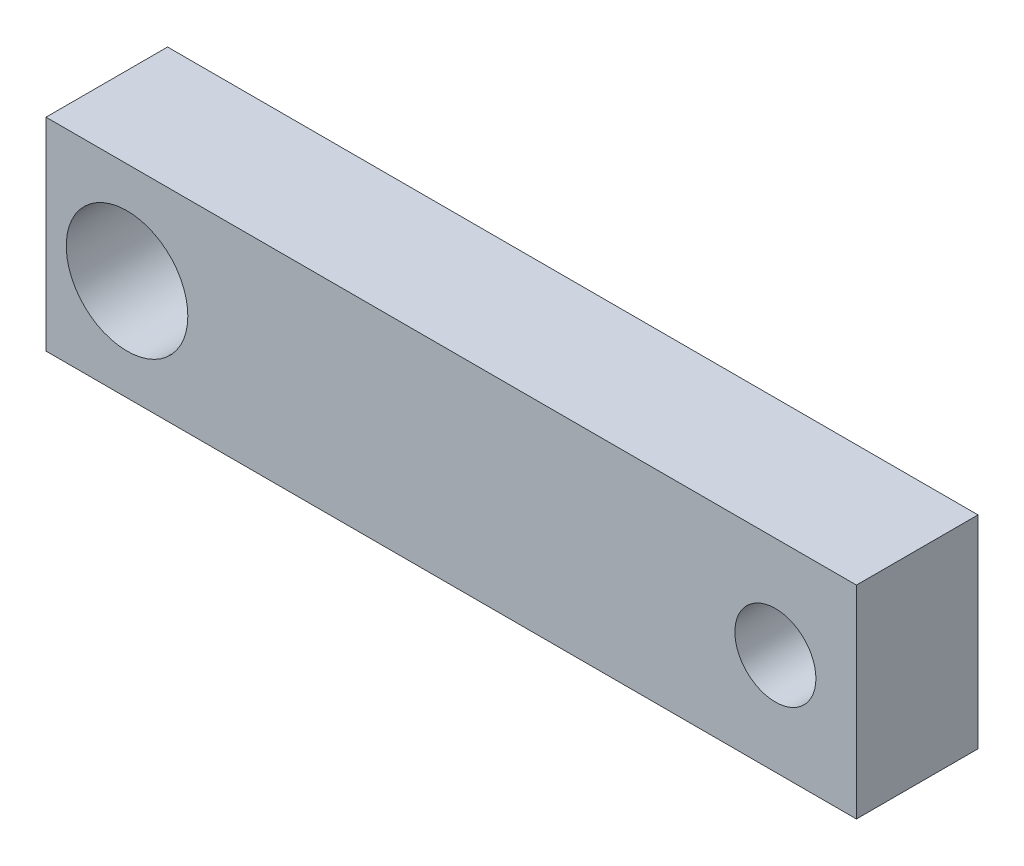
ISO-10303-21;
HEADER;
FILE_DESCRIPTION(('STEP AP214'),'2;1');
FILE_NAME('part.step','',(''),(''),'','','');
FILE_SCHEMA(('AUTOMOTIVE_DESIGN { 1 0 10303 214 1 1 1 1 }'));
ENDSEC;
DATA;
#1=APPLICATION_CONTEXT('core data for automotive mechanical design processes');
#2=APPLICATION_PROTOCOL_DEFINITION('international standard','automotive_design',2000,#1);
#3=PRODUCT_CONTEXT('',#1,'mechanical');
#4=PRODUCT('Part','Part','',(#3));
#5=PRODUCT_RELATED_PRODUCT_CATEGORY('part','',(#4));
#6=PRODUCT_DEFINITION_FORMATION('','',#4);
#7=PRODUCT_DEFINITION_CONTEXT('part definition',#1,'design');
#8=PRODUCT_DEFINITION('design','',#6,#7);
#9=PRODUCT_DEFINITION_SHAPE('','',#8);
#10=(LENGTH_UNIT() NAMED_UNIT(*) SI_UNIT(.MILLI.,.METRE.));
#11=(NAMED_UNIT(*) PLANE_ANGLE_UNIT() SI_UNIT($,.RADIAN.));
#12=(NAMED_UNIT(*) SI_UNIT($,.STERADIAN.) SOLID_ANGLE_UNIT());
#13=UNCERTAINTY_MEASURE_WITH_UNIT(LENGTH_MEASURE(1.E-05),#10,'distance_accuracy_value','');
#14=(GEOMETRIC_REPRESENTATION_CONTEXT(3) GLOBAL_UNCERTAINTY_ASSIGNED_CONTEXT((#13)) GLOBAL_UNIT_ASSIGNED_CONTEXT((#10,
#11,#12)) REPRESENTATION_CONTEXT('',''));
#15=CARTESIAN_POINT('',(0.,0.,0.));
#16=DIRECTION('',(0.,0.,1.));
#17=DIRECTION('',(1.,0.,0.));
#18=AXIS2_PLACEMENT_3D('',#15,#16,#17);
#19=CARTESIAN_POINT('',(0.,0.,3.));
#20=DIRECTION('',(0.,0.,1.));
#21=DIRECTION('',(1.,0.,0.));
#22=AXIS2_PLACEMENT_3D('',#19,#20,#21);
#23=PLANE('',#22);
#24=CARTESIAN_POINT('',(-8.,0.,3.));
#25=DIRECTION('',(0.,0.,1.));
#26=DIRECTION('',(1.,0.,0.));
#27=AXIS2_PLACEMENT_3D('',#24,#25,#26);
#28=CIRCLE('',#27,1.5);
#29=CARTESIAN_POINT('',(-6.5,0.,3.));
#30=VERTEX_POINT('',#29);
#31=EDGE_CURVE('E129',#30,#30,#28,.T.);
#32=ORIENTED_EDGE('',*,*,#31,.F.);
#33=EDGE_LOOP('',(#32));
#34=FACE_BOUND('',#33,.T.);
#35=DIRECTION('',(0.,-1.,0.));
#36=VECTOR('',#35,1.);
#37=CARTESIAN_POINT('',(-10.,2.5,3.));
#38=LINE('',#37,#36);
#39=CARTESIAN_POINT('',(-10.,2.5,3.));
#40=VERTEX_POINT('',#39);
#41=CARTESIAN_POINT('',(-10.,-2.5,3.));
#42=VERTEX_POINT('',#41);
#43=EDGE_CURVE('E113',#40,#42,#38,.T.);
#44=ORIENTED_EDGE('',*,*,#43,.T.);
#45=DIRECTION('',(1.,0.,0.));
#46=VECTOR('',#45,1.);
#47=CARTESIAN_POINT('',(-10.,-2.5,3.));
#48=LINE('',#47,#46);
#49=CARTESIAN_POINT('',(10.,-2.5,3.));
#50=VERTEX_POINT('',#49);
#51=EDGE_CURVE('E105',#42,#50,#48,.T.);
#52=ORIENTED_EDGE('',*,*,#51,.T.);
#53=DIRECTION('',(0.,-1.,0.));
#54=VECTOR('',#53,1.);
#55=CARTESIAN_POINT('',(10.,2.5,3.));
#56=LINE('',#55,#54);
#57=CARTESIAN_POINT('',(10.,2.5,3.));
#58=VERTEX_POINT('',#57);
#59=EDGE_CURVE('E112',#58,#50,#56,.T.);
#60=ORIENTED_EDGE('',*,*,#59,.F.);
#61=DIRECTION('',(1.,0.,0.));
#62=VECTOR('',#61,1.);
#63=CARTESIAN_POINT('',(-10.,2.5,3.));
#64=LINE('',#63,#62);
#65=EDGE_CURVE('E122',#40,#58,#64,.T.);
#66=ORIENTED_EDGE('',*,*,#65,.F.);
#67=EDGE_LOOP('',(#44,#52,#60,#66));
#68=FACE_BOUND('',#67,.T.);
#69=CARTESIAN_POINT('',(8.,0.,3.));
#70=DIRECTION('',(0.,0.,1.));
#71=DIRECTION('',(1.,0.,0.));
#72=AXIS2_PLACEMENT_3D('',#69,#70,#71);
#73=CIRCLE('',#72,1.);
#74=CARTESIAN_POINT('',(9.,0.,3.));
#75=VERTEX_POINT('',#74);
#76=EDGE_CURVE('E142',#75,#75,#73,.T.);
#77=ORIENTED_EDGE('',*,*,#76,.F.);
#78=EDGE_LOOP('',(#77));
#79=FACE_BOUND('',#78,.T.);
#80=ADVANCED_FACE('F63',(#34,#68,#79),#23,.T.);
#81=CARTESIAN_POINT('',(0.,0.,0.));
#82=DIRECTION('',(0.,0.,1.));
#83=DIRECTION('',(1.,0.,0.));
#84=AXIS2_PLACEMENT_3D('',#81,#82,#83);
#85=PLANE('',#84);
#86=DIRECTION('',(0.,-1.,0.));
#87=VECTOR('',#86,1.);
#88=CARTESIAN_POINT('',(-10.,2.5,0.));
#89=LINE('',#88,#87);
#90=CARTESIAN_POINT('',(-10.,2.5,0.));
#91=VERTEX_POINT('',#90);
#92=CARTESIAN_POINT('',(-10.,-2.5,0.));
#93=VERTEX_POINT('',#92);
#94=EDGE_CURVE('E127',#91,#93,#89,.T.);
#95=ORIENTED_EDGE('',*,*,#94,.F.);
#96=DIRECTION('',(1.,0.,0.));
#97=VECTOR('',#96,1.);
#98=CARTESIAN_POINT('',(-10.,2.5,0.));
#99=LINE('',#98,#97);
#100=CARTESIAN_POINT('',(10.,2.5,0.));
#101=VERTEX_POINT('',#100);
#102=EDGE_CURVE('E133',#91,#101,#99,.T.);
#103=ORIENTED_EDGE('',*,*,#102,.T.);
#104=DIRECTION('',(0.,-1.,0.));
#105=VECTOR('',#104,1.);
#106=CARTESIAN_POINT('',(10.,2.5,0.));
#107=LINE('',#106,#105);
#108=CARTESIAN_POINT('',(10.,-2.5,0.));
#109=VERTEX_POINT('',#108);
#110=EDGE_CURVE('E131',#101,#109,#107,.T.);
#111=ORIENTED_EDGE('',*,*,#110,.T.);
#112=DIRECTION('',(1.,0.,0.));
#113=VECTOR('',#112,1.);
#114=CARTESIAN_POINT('',(-10.,-2.5,0.));
#115=LINE('',#114,#113);
#116=EDGE_CURVE('E118',#93,#109,#115,.T.);
#117=ORIENTED_EDGE('',*,*,#116,.F.);
#118=EDGE_LOOP('',(#95,#103,#111,#117));
#119=FACE_BOUND('',#118,.T.);
#120=CARTESIAN_POINT('',(-8.,0.,0.));
#121=DIRECTION('',(0.,0.,1.));
#122=DIRECTION('',(1.,0.,0.));
#123=AXIS2_PLACEMENT_3D('',#120,#121,#122);
#124=CIRCLE('',#123,1.5);
#125=CARTESIAN_POINT('',(-6.5,0.,0.));
#126=VERTEX_POINT('',#125);
#127=EDGE_CURVE('E139',#126,#126,#124,.T.);
#128=ORIENTED_EDGE('',*,*,#127,.T.);
#129=EDGE_LOOP('',(#128));
#130=FACE_BOUND('',#129,.T.);
#131=CARTESIAN_POINT('',(8.,0.,0.));
#132=DIRECTION('',(0.,0.,1.));
#133=DIRECTION('',(1.,0.,0.));
#134=AXIS2_PLACEMENT_3D('',#131,#132,#133);
#135=CIRCLE('',#134,1.);
#136=CARTESIAN_POINT('',(9.,0.,0.));
#137=VERTEX_POINT('',#136);
#138=EDGE_CURVE('E145',#137,#137,#135,.T.);
#139=ORIENTED_EDGE('',*,*,#138,.T.);
#140=EDGE_LOOP('',(#139));
#141=FACE_BOUND('',#140,.T.);
#142=ADVANCED_FACE('F154',(#119,#130,#141),#85,.F.);
#143=CARTESIAN_POINT('',(-10.,2.5,3.));
#144=DIRECTION('',(1.,0.,0.));
#145=DIRECTION('',(0.,0.,-1.));
#146=AXIS2_PLACEMENT_3D('',#143,#144,#145);
#147=PLANE('',#146);
#148=ORIENTED_EDGE('',*,*,#94,.T.);
#149=DIRECTION('',(0.,0.,-1.));
#150=VECTOR('',#149,1.);
#151=CARTESIAN_POINT('',(-10.,-2.5,3.));
#152=LINE('',#151,#150);
#153=EDGE_CURVE('E12',#42,#93,#152,.T.);
#154=ORIENTED_EDGE('',*,*,#153,.F.);
#155=ORIENTED_EDGE('',*,*,#43,.F.);
#156=DIRECTION('',(0.,0.,-1.));
#157=VECTOR('',#156,1.);
#158=CARTESIAN_POINT('',(-10.,2.5,3.));
#159=LINE('',#158,#157);
#160=EDGE_CURVE('E80',#40,#91,#159,.T.);
#161=ORIENTED_EDGE('',*,*,#160,.T.);
#162=EDGE_LOOP('',(#148,#154,#155,#161));
#163=FACE_BOUND('',#162,.T.);
#164=ADVANCED_FACE('F65',(#163),#147,.F.);
#165=CARTESIAN_POINT('',(-10.,-2.5,3.));
#166=DIRECTION('',(0.,1.,0.));
#167=DIRECTION('',(0.,0.,1.));
#168=AXIS2_PLACEMENT_3D('',#165,#166,#167);
#169=PLANE('',#168);
#170=ORIENTED_EDGE('',*,*,#116,.T.);
#171=DIRECTION('',(0.,0.,-1.));
#172=VECTOR('',#171,1.);
#173=CARTESIAN_POINT('',(10.,-2.5,3.));
#174=LINE('',#173,#172);
#175=EDGE_CURVE('E72',#50,#109,#174,.T.);
#176=ORIENTED_EDGE('',*,*,#175,.F.);
#177=ORIENTED_EDGE('',*,*,#51,.F.);
#178=ORIENTED_EDGE('',*,*,#153,.T.);
#179=EDGE_LOOP('',(#170,#176,#177,#178));
#180=FACE_BOUND('',#179,.T.);
#181=ADVANCED_FACE('F117',(#180),#169,.F.);
#182=CARTESIAN_POINT('',(10.,2.5,3.));
#183=DIRECTION('',(1.,0.,0.));
#184=DIRECTION('',(0.,0.,-1.));
#185=AXIS2_PLACEMENT_3D('',#182,#183,#184);
#186=PLANE('',#185);
#187=ORIENTED_EDGE('',*,*,#110,.F.);
#188=DIRECTION('',(0.,0.,-1.));
#189=VECTOR('',#188,1.);
#190=CARTESIAN_POINT('',(10.,2.5,3.));
#191=LINE('',#190,#189);
#192=EDGE_CURVE('E94',#58,#101,#191,.T.);
#193=ORIENTED_EDGE('',*,*,#192,.F.);
#194=ORIENTED_EDGE('',*,*,#59,.T.);
#195=ORIENTED_EDGE('',*,*,#175,.T.);
#196=EDGE_LOOP('',(#187,#193,#194,#195));
#197=FACE_BOUND('',#196,.T.);
#198=ADVANCED_FACE('F121',(#197),#186,.T.);
#199=CARTESIAN_POINT('',(-10.,2.5,3.));
#200=DIRECTION('',(0.,1.,0.));
#201=DIRECTION('',(0.,0.,1.));
#202=AXIS2_PLACEMENT_3D('',#199,#200,#201);
#203=PLANE('',#202);
#204=ORIENTED_EDGE('',*,*,#102,.F.);
#205=ORIENTED_EDGE('',*,*,#160,.F.);
#206=ORIENTED_EDGE('',*,*,#65,.T.);
#207=ORIENTED_EDGE('',*,*,#192,.T.);
#208=EDGE_LOOP('',(#204,#205,#206,#207));
#209=FACE_BOUND('',#208,.T.);
#210=ADVANCED_FACE('F166',(#209),#203,.T.);
#211=CARTESIAN_POINT('',(-8.,0.,3.));
#212=DIRECTION('',(0.,0.,-1.));
#213=DIRECTION('',(-1.,0.,0.));
#214=AXIS2_PLACEMENT_3D('',#211,#212,#213);
#215=CYLINDRICAL_SURFACE('',#214,1.5);
#216=ORIENTED_EDGE('',*,*,#31,.T.);
#217=EDGE_LOOP('',(#216));
#218=FACE_BOUND('',#217,.T.);
#219=ORIENTED_EDGE('',*,*,#127,.F.);
#220=EDGE_LOOP('',(#219));
#221=FACE_BOUND('',#220,.T.);
#222=ADVANCED_FACE('F163',(#218,#221),#215,.F.);
#223=CARTESIAN_POINT('',(8.,0.,3.));
#224=DIRECTION('',(0.,0.,-1.));
#225=DIRECTION('',(-1.,0.,0.));
#226=AXIS2_PLACEMENT_3D('',#223,#224,#225);
#227=CYLINDRICAL_SURFACE('',#226,1.);
#228=ORIENTED_EDGE('',*,*,#76,.T.);
#229=EDGE_LOOP('',(#228));
#230=FACE_BOUND('',#229,.T.);
#231=ORIENTED_EDGE('',*,*,#138,.F.);
#232=EDGE_LOOP('',(#231));
#233=FACE_BOUND('',#232,.T.);
#234=ADVANCED_FACE('F151',(#230,#233),#227,.F.);
#235=CLOSED_SHELL('',(#80,#142,#164,#181,#198,#210,#222,#234));
#236=MANIFOLD_SOLID_BREP('B2',#235);
#237=ADVANCED_BREP_SHAPE_REPRESENTATION('',(#18,#236),#14);
#238=SHAPE_DEFINITION_REPRESENTATION(#9,#237);
ENDSEC;
END-ISO-10303-21;
